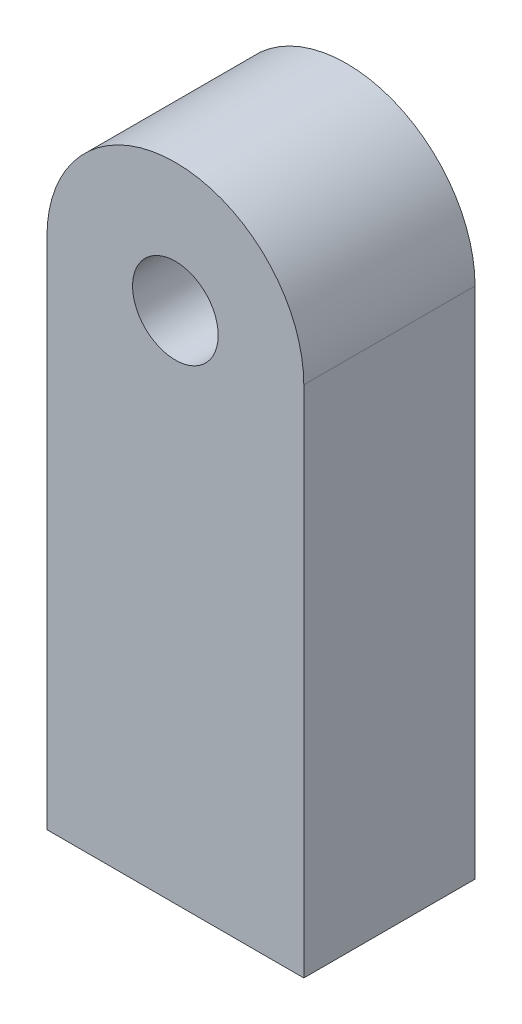
ISO-10303-21;
HEADER;
FILE_DESCRIPTION(('STEP AP214'),'2;1');
FILE_NAME('part.step','',(''),(''),'','','');
FILE_SCHEMA(('AUTOMOTIVE_DESIGN { 1 0 10303 214 1 1 1 1 }'));
ENDSEC;
DATA;
#1=APPLICATION_CONTEXT('core data for automotive mechanical design processes');
#2=APPLICATION_PROTOCOL_DEFINITION('international standard','automotive_design',2000,#1);
#3=PRODUCT_CONTEXT('',#1,'mechanical');
#4=PRODUCT('Part','Part','',(#3));
#5=PRODUCT_RELATED_PRODUCT_CATEGORY('part','',(#4));
#6=PRODUCT_DEFINITION_FORMATION('','',#4);
#7=PRODUCT_DEFINITION_CONTEXT('part definition',#1,'design');
#8=PRODUCT_DEFINITION('design','',#6,#7);
#9=PRODUCT_DEFINITION_SHAPE('','',#8);
#10=(LENGTH_UNIT() NAMED_UNIT(*) SI_UNIT(.MILLI.,.METRE.));
#11=(NAMED_UNIT(*) PLANE_ANGLE_UNIT() SI_UNIT($,.RADIAN.));
#12=(NAMED_UNIT(*) SI_UNIT($,.STERADIAN.) SOLID_ANGLE_UNIT());
#13=UNCERTAINTY_MEASURE_WITH_UNIT(LENGTH_MEASURE(1.E-05),#10,'distance_accuracy_value','');
#14=(GEOMETRIC_REPRESENTATION_CONTEXT(3) GLOBAL_UNCERTAINTY_ASSIGNED_CONTEXT((#13)) GLOBAL_UNIT_ASSIGNED_CONTEXT((#10,
#11,#12)) REPRESENTATION_CONTEXT('',''));
#15=CARTESIAN_POINT('',(0.,0.,0.));
#16=DIRECTION('',(0.,0.,1.));
#17=DIRECTION('',(1.,0.,0.));
#18=AXIS2_PLACEMENT_3D('',#15,#16,#17);
#19=CARTESIAN_POINT('',(-40.9534817386,12.6799055880962,-6.35));
#20=DIRECTION('',(0.,-1.,0.));
#21=DIRECTION('',(0.,0.,-1.));
#22=AXIS2_PLACEMENT_3D('',#19,#20,#21);
#23=PLANE('',#22);
#24=DIRECTION('',(0.,0.,1.));
#25=VECTOR('',#24,1.);
#26=CARTESIAN_POINT('',(-40.9534817386,12.6799055880962,-6.35));
#27=LINE('',#26,#25);
#28=CARTESIAN_POINT('',(-40.9534817386,12.6799055880962,-6.35));
#29=VERTEX_POINT('',#28);
#30=CARTESIAN_POINT('',(-40.9534817386,12.6799055880962,6.35));
#31=VERTEX_POINT('',#30);
#32=EDGE_CURVE('E35',#29,#31,#27,.T.);
#33=ORIENTED_EDGE('',*,*,#32,.T.);
#34=DIRECTION('',(1.,0.,0.));
#35=VECTOR('',#34,1.);
#36=CARTESIAN_POINT('',(-40.9534817386,12.6799055880962,6.35));
#37=LINE('',#36,#35);
#38=CARTESIAN_POINT('',(-60.0034817386,12.6799055880962,6.35));
#39=VERTEX_POINT('',#38);
#40=EDGE_CURVE('E72',#39,#31,#37,.T.);
#41=ORIENTED_EDGE('',*,*,#40,.F.);
#42=DIRECTION('',(0.,0.,1.));
#43=VECTOR('',#42,1.);
#44=CARTESIAN_POINT('',(-60.0034817386,12.6799055880962,-6.35));
#45=LINE('',#44,#43);
#46=CARTESIAN_POINT('',(-60.0034817386,12.6799055880962,-6.35));
#47=VERTEX_POINT('',#46);
#48=EDGE_CURVE('E11',#47,#39,#45,.T.);
#49=ORIENTED_EDGE('',*,*,#48,.F.);
#50=DIRECTION('',(1.,0.,0.));
#51=VECTOR('',#50,1.);
#52=CARTESIAN_POINT('',(-40.9534817386,12.6799055880962,-6.35));
#53=LINE('',#52,#51);
#54=EDGE_CURVE('E73',#47,#29,#53,.T.);
#55=ORIENTED_EDGE('',*,*,#54,.T.);
#56=EDGE_LOOP('',(#33,#41,#49,#55));
#57=FACE_BOUND('',#56,.T.);
#58=ADVANCED_FACE('F32',(#57),#23,.T.);
#59=CARTESIAN_POINT('',(-60.0034817386,12.6799055880962,-6.35));
#60=DIRECTION('',(-1.,0.,0.));
#61=DIRECTION('',(0.,0.,1.));
#62=AXIS2_PLACEMENT_3D('',#59,#60,#61);
#63=PLANE('',#62);
#64=ORIENTED_EDGE('',*,*,#48,.T.);
#65=DIRECTION('',(0.,-1.,0.));
#66=VECTOR('',#65,1.);
#67=CARTESIAN_POINT('',(-60.0034817386,12.6799055880962,6.35));
#68=LINE('',#67,#66);
#69=CARTESIAN_POINT('',(-60.0034817386,50.7799055880962,6.35));
#70=VERTEX_POINT('',#69);
#71=EDGE_CURVE('E90',#70,#39,#68,.T.);
#72=ORIENTED_EDGE('',*,*,#71,.F.);
#73=DIRECTION('',(0.,0.,1.));
#74=VECTOR('',#73,1.);
#75=CARTESIAN_POINT('',(-60.0034817386,50.7799055880962,-6.35));
#76=LINE('',#75,#74);
#77=CARTESIAN_POINT('',(-60.0034817386,50.7799055880962,-6.35));
#78=VERTEX_POINT('',#77);
#79=EDGE_CURVE('E40',#78,#70,#76,.T.);
#80=ORIENTED_EDGE('',*,*,#79,.F.);
#81=DIRECTION('',(0.,-1.,0.));
#82=VECTOR('',#81,1.);
#83=CARTESIAN_POINT('',(-60.0034817386,12.6799055880962,-6.35));
#84=LINE('',#83,#82);
#85=EDGE_CURVE('E78',#78,#47,#84,.T.);
#86=ORIENTED_EDGE('',*,*,#85,.T.);
#87=EDGE_LOOP('',(#64,#72,#80,#86));
#88=FACE_BOUND('',#87,.T.);
#89=ADVANCED_FACE('F111',(#88),#63,.T.);
#90=CARTESIAN_POINT('',(-50.4784817386,50.7799055880962,-6.35));
#91=DIRECTION('',(0.,0.,1.));
#92=DIRECTION('',(1.,0.,0.));
#93=AXIS2_PLACEMENT_3D('',#90,#91,#92);
#94=CYLINDRICAL_SURFACE('',#93,9.525);
#95=ORIENTED_EDGE('',*,*,#79,.T.);
#96=CARTESIAN_POINT('',(-50.4784817386,50.7799055880962,6.35));
#97=DIRECTION('',(0.,0.,1.));
#98=DIRECTION('',(-1.,0.,0.));
#99=AXIS2_PLACEMENT_3D('',#96,#97,#98);
#100=CIRCLE('',#99,9.525);
#101=CARTESIAN_POINT('',(-40.9534817386,50.7799055880962,6.35));
#102=VERTEX_POINT('',#101);
#103=EDGE_CURVE('E85',#102,#70,#100,.T.);
#104=ORIENTED_EDGE('',*,*,#103,.F.);
#105=DIRECTION('',(0.,0.,1.));
#106=VECTOR('',#105,1.);
#107=CARTESIAN_POINT('',(-40.9534817386,50.7799055880962,-6.35));
#108=LINE('',#107,#106);
#109=CARTESIAN_POINT('',(-40.9534817386,50.7799055880962,-6.35));
#110=VERTEX_POINT('',#109);
#111=EDGE_CURVE('E77',#110,#102,#108,.T.);
#112=ORIENTED_EDGE('',*,*,#111,.F.);
#113=CARTESIAN_POINT('',(-50.4784817386,50.7799055880962,-6.35));
#114=DIRECTION('',(0.,0.,1.));
#115=DIRECTION('',(-1.,0.,0.));
#116=AXIS2_PLACEMENT_3D('',#113,#114,#115);
#117=CIRCLE('',#116,9.525);
#118=EDGE_CURVE('E104',#110,#78,#117,.T.);
#119=ORIENTED_EDGE('',*,*,#118,.T.);
#120=EDGE_LOOP('',(#95,#104,#112,#119));
#121=FACE_BOUND('',#120,.T.);
#122=ADVANCED_FACE('F108',(#121),#94,.T.);
#123=CARTESIAN_POINT('',(-40.9534817386,50.7799055880962,-6.35));
#124=DIRECTION('',(1.,0.,0.));
#125=DIRECTION('',(0.,1.,0.));
#126=AXIS2_PLACEMENT_3D('',#123,#124,#125);
#127=PLANE('',#126);
#128=ORIENTED_EDGE('',*,*,#111,.T.);
#129=DIRECTION('',(0.,1.,0.));
#130=VECTOR('',#129,1.);
#131=CARTESIAN_POINT('',(-40.9534817386,50.7799055880962,6.35));
#132=LINE('',#131,#130);
#133=EDGE_CURVE('E80',#31,#102,#132,.T.);
#134=ORIENTED_EDGE('',*,*,#133,.F.);
#135=ORIENTED_EDGE('',*,*,#32,.F.);
#136=DIRECTION('',(0.,1.,0.));
#137=VECTOR('',#136,1.);
#138=CARTESIAN_POINT('',(-40.9534817386,50.7799055880962,-6.35));
#139=LINE('',#138,#137);
#140=EDGE_CURVE('E102',#29,#110,#139,.T.);
#141=ORIENTED_EDGE('',*,*,#140,.T.);
#142=EDGE_LOOP('',(#128,#134,#135,#141));
#143=FACE_BOUND('',#142,.T.);
#144=ADVANCED_FACE('F81',(#143),#127,.T.);
#145=CARTESIAN_POINT('',(-50.4784817386,50.7799055880962,-6.35));
#146=DIRECTION('',(0.,0.,-1.));
#147=DIRECTION('',(-1.,0.,0.));
#148=AXIS2_PLACEMENT_3D('',#145,#146,#147);
#149=PLANE('',#148);
#150=CARTESIAN_POINT('',(-50.4784817386,50.7799055880962,-6.35));
#151=DIRECTION('',(0.,0.,1.));
#152=DIRECTION('',(1.,0.,0.));
#153=AXIS2_PLACEMENT_3D('',#150,#151,#152);
#154=CIRCLE('',#153,3.175);
#155=CARTESIAN_POINT('',(-47.3034817386,50.7799055880962,-6.35));
#156=VERTEX_POINT('',#155);
#157=EDGE_CURVE('E98',#156,#156,#154,.T.);
#158=ORIENTED_EDGE('',*,*,#157,.T.);
#159=EDGE_LOOP('',(#158));
#160=FACE_BOUND('',#159,.T.);
#161=ORIENTED_EDGE('',*,*,#54,.F.);
#162=ORIENTED_EDGE('',*,*,#85,.F.);
#163=ORIENTED_EDGE('',*,*,#118,.F.);
#164=ORIENTED_EDGE('',*,*,#140,.F.);
#165=EDGE_LOOP('',(#161,#162,#163,#164));
#166=FACE_BOUND('',#165,.T.);
#167=ADVANCED_FACE('F113',(#160,#166),#149,.T.);
#168=CARTESIAN_POINT('',(-50.4784817386,50.7799055880962,-6.35));
#169=DIRECTION('',(0.,0.,1.));
#170=DIRECTION('',(1.,0.,0.));
#171=AXIS2_PLACEMENT_3D('',#168,#169,#170);
#172=CYLINDRICAL_SURFACE('',#171,3.175);
#173=ORIENTED_EDGE('',*,*,#157,.F.);
#174=EDGE_LOOP('',(#173));
#175=FACE_BOUND('',#174,.T.);
#176=CARTESIAN_POINT('',(-50.4784817386,50.7799055880962,6.35));
#177=DIRECTION('',(0.,0.,1.));
#178=DIRECTION('',(1.,0.,0.));
#179=AXIS2_PLACEMENT_3D('',#176,#177,#178);
#180=CIRCLE('',#179,3.175);
#181=CARTESIAN_POINT('',(-47.3034817386,50.7799055880962,6.35));
#182=VERTEX_POINT('',#181);
#183=EDGE_CURVE('E91',#182,#182,#180,.T.);
#184=ORIENTED_EDGE('',*,*,#183,.T.);
#185=EDGE_LOOP('',(#184));
#186=FACE_BOUND('',#185,.T.);
#187=ADVANCED_FACE('F115',(#175,#186),#172,.F.);
#188=CARTESIAN_POINT('',(-50.4784817386,50.7799055880962,6.35));
#189=DIRECTION('',(0.,0.,-1.));
#190=DIRECTION('',(-1.,0.,0.));
#191=AXIS2_PLACEMENT_3D('',#188,#189,#190);
#192=PLANE('',#191);
#193=ORIENTED_EDGE('',*,*,#40,.T.);
#194=ORIENTED_EDGE('',*,*,#133,.T.);
#195=ORIENTED_EDGE('',*,*,#103,.T.);
#196=ORIENTED_EDGE('',*,*,#71,.T.);
#197=EDGE_LOOP('',(#193,#194,#195,#196));
#198=FACE_BOUND('',#197,.T.);
#199=ORIENTED_EDGE('',*,*,#183,.F.);
#200=EDGE_LOOP('',(#199));
#201=FACE_BOUND('',#200,.T.);
#202=ADVANCED_FACE('F88',(#198,#201),#192,.F.);
#203=CLOSED_SHELL('',(#58,#89,#122,#144,#167,#187,#202));
#204=MANIFOLD_SOLID_BREP('B2',#203);
#205=ADVANCED_BREP_SHAPE_REPRESENTATION('',(#18,#204),#14);
#206=SHAPE_DEFINITION_REPRESENTATION(#9,#205);
ENDSEC;
END-ISO-10303-21;
